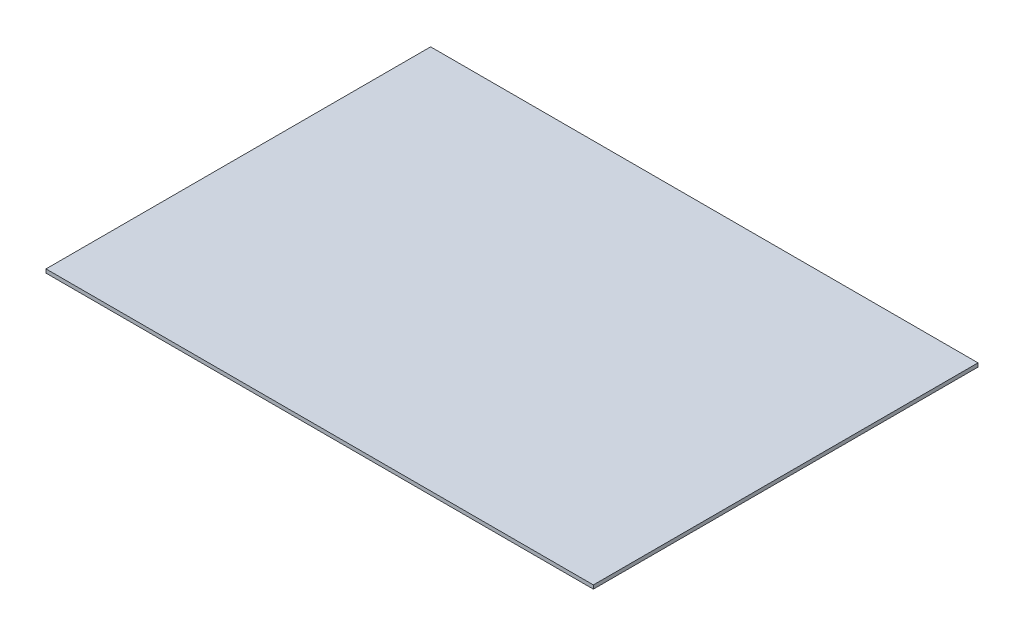
ISO-10303-21;
HEADER;
FILE_DESCRIPTION(('STEP AP214'),'2;1');
FILE_NAME('part.step','',(''),(''),'','','');
FILE_SCHEMA(('AUTOMOTIVE_DESIGN { 1 0 10303 214 1 1 1 1 }'));
ENDSEC;
DATA;
#1=APPLICATION_CONTEXT('core data for automotive mechanical design processes');
#2=APPLICATION_PROTOCOL_DEFINITION('international standard','automotive_design',2000,#1);
#3=PRODUCT_CONTEXT('',#1,'mechanical');
#4=PRODUCT('Part','Part','',(#3));
#5=PRODUCT_RELATED_PRODUCT_CATEGORY('part','',(#4));
#6=PRODUCT_DEFINITION_FORMATION('','',#4);
#7=PRODUCT_DEFINITION_CONTEXT('part definition',#1,'design');
#8=PRODUCT_DEFINITION('design','',#6,#7);
#9=PRODUCT_DEFINITION_SHAPE('','',#8);
#10=(LENGTH_UNIT() NAMED_UNIT(*) SI_UNIT(.MILLI.,.METRE.));
#11=(NAMED_UNIT(*) PLANE_ANGLE_UNIT() SI_UNIT($,.RADIAN.));
#12=(NAMED_UNIT(*) SI_UNIT($,.STERADIAN.) SOLID_ANGLE_UNIT());
#13=UNCERTAINTY_MEASURE_WITH_UNIT(LENGTH_MEASURE(1.E-05),#10,'distance_accuracy_value','');
#14=(GEOMETRIC_REPRESENTATION_CONTEXT(3) GLOBAL_UNCERTAINTY_ASSIGNED_CONTEXT((#13)) GLOBAL_UNIT_ASSIGNED_CONTEXT((#10,
#11,#12)) REPRESENTATION_CONTEXT('',''));
#15=CARTESIAN_POINT('',(0.,0.,0.));
#16=DIRECTION('',(0.,0.,1.));
#17=DIRECTION('',(1.,0.,0.));
#18=AXIS2_PLACEMENT_3D('',#15,#16,#17);
#19=CARTESIAN_POINT('',(117.475,0.79375,-82.55));
#20=DIRECTION('',(-1.,0.,0.));
#21=DIRECTION('',(0.,0.,1.));
#22=AXIS2_PLACEMENT_3D('',#19,#20,#21);
#23=PLANE('',#22);
#24=DIRECTION('',(0.,0.,-1.));
#25=VECTOR('',#24,1.);
#26=CARTESIAN_POINT('',(117.475,-0.79375,-82.55));
#27=LINE('',#26,#25);
#28=CARTESIAN_POINT('',(117.475,-0.79375,82.55));
#29=VERTEX_POINT('',#28);
#30=CARTESIAN_POINT('',(117.475,-0.79375,-82.55));
#31=VERTEX_POINT('',#30);
#32=EDGE_CURVE('E95',#29,#31,#27,.T.);
#33=ORIENTED_EDGE('',*,*,#32,.T.);
#34=DIRECTION('',(0.,-1.,0.));
#35=VECTOR('',#34,1.);
#36=CARTESIAN_POINT('',(117.475,0.79375,-82.55));
#37=LINE('',#36,#35);
#38=CARTESIAN_POINT('',(117.475,0.79375,-82.55));
#39=VERTEX_POINT('',#38);
#40=EDGE_CURVE('E11',#39,#31,#37,.T.);
#41=ORIENTED_EDGE('',*,*,#40,.F.);
#42=DIRECTION('',(0.,0.,-1.));
#43=VECTOR('',#42,1.);
#44=CARTESIAN_POINT('',(117.475,0.79375,-82.55));
#45=LINE('',#44,#43);
#46=CARTESIAN_POINT('',(117.475,0.79375,82.55));
#47=VERTEX_POINT('',#46);
#48=EDGE_CURVE('E83',#47,#39,#45,.T.);
#49=ORIENTED_EDGE('',*,*,#48,.F.);
#50=DIRECTION('',(0.,-1.,0.));
#51=VECTOR('',#50,1.);
#52=CARTESIAN_POINT('',(117.475,0.79375,82.55));
#53=LINE('',#52,#51);
#54=EDGE_CURVE('E91',#47,#29,#53,.T.);
#55=ORIENTED_EDGE('',*,*,#54,.T.);
#56=EDGE_LOOP('',(#33,#41,#49,#55));
#57=FACE_BOUND('',#56,.T.);
#58=ADVANCED_FACE('F32',(#57),#23,.F.);
#59=CARTESIAN_POINT('',(-117.475,0.79375,-82.55));
#60=DIRECTION('',(0.,0.,1.));
#61=DIRECTION('',(1.,0.,0.));
#62=AXIS2_PLACEMENT_3D('',#59,#60,#61);
#63=PLANE('',#62);
#64=DIRECTION('',(-1.,0.,0.));
#65=VECTOR('',#64,1.);
#66=CARTESIAN_POINT('',(-117.475,-0.79375,-82.55));
#67=LINE('',#66,#65);
#68=CARTESIAN_POINT('',(-117.475,-0.79375,-82.55));
#69=VERTEX_POINT('',#68);
#70=EDGE_CURVE('E87',#31,#69,#67,.T.);
#71=ORIENTED_EDGE('',*,*,#70,.T.);
#72=DIRECTION('',(0.,-1.,0.));
#73=VECTOR('',#72,1.);
#74=CARTESIAN_POINT('',(-117.475,0.79375,-82.55));
#75=LINE('',#74,#73);
#76=CARTESIAN_POINT('',(-117.475,0.79375,-82.55));
#77=VERTEX_POINT('',#76);
#78=EDGE_CURVE('E40',#77,#69,#75,.T.);
#79=ORIENTED_EDGE('',*,*,#78,.F.);
#80=DIRECTION('',(-1.,0.,0.));
#81=VECTOR('',#80,1.);
#82=CARTESIAN_POINT('',(-117.475,0.79375,-82.55));
#83=LINE('',#82,#81);
#84=EDGE_CURVE('E78',#39,#77,#83,.T.);
#85=ORIENTED_EDGE('',*,*,#84,.F.);
#86=ORIENTED_EDGE('',*,*,#40,.T.);
#87=EDGE_LOOP('',(#71,#79,#85,#86));
#88=FACE_BOUND('',#87,.T.);
#89=ADVANCED_FACE('F86',(#88),#63,.F.);
#90=CARTESIAN_POINT('',(-117.475,0.79375,-82.55));
#91=DIRECTION('',(1.,0.,0.));
#92=DIRECTION('',(0.,0.,-1.));
#93=AXIS2_PLACEMENT_3D('',#90,#91,#92);
#94=PLANE('',#93);
#95=DIRECTION('',(0.,0.,1.));
#96=VECTOR('',#95,1.);
#97=CARTESIAN_POINT('',(-117.475,-0.79375,-82.55));
#98=LINE('',#97,#96);
#99=CARTESIAN_POINT('',(-117.475,-0.79375,82.55));
#100=VERTEX_POINT('',#99);
#101=EDGE_CURVE('E65',#69,#100,#98,.T.);
#102=ORIENTED_EDGE('',*,*,#101,.T.);
#103=DIRECTION('',(0.,-1.,0.));
#104=VECTOR('',#103,1.);
#105=CARTESIAN_POINT('',(-117.475,0.79375,82.55));
#106=LINE('',#105,#104);
#107=CARTESIAN_POINT('',(-117.475,0.79375,82.55));
#108=VERTEX_POINT('',#107);
#109=EDGE_CURVE('E88',#108,#100,#106,.T.);
#110=ORIENTED_EDGE('',*,*,#109,.F.);
#111=DIRECTION('',(0.,0.,1.));
#112=VECTOR('',#111,1.);
#113=CARTESIAN_POINT('',(-117.475,0.79375,-82.55));
#114=LINE('',#113,#112);
#115=EDGE_CURVE('E81',#77,#108,#114,.T.);
#116=ORIENTED_EDGE('',*,*,#115,.F.);
#117=ORIENTED_EDGE('',*,*,#78,.T.);
#118=EDGE_LOOP('',(#102,#110,#116,#117));
#119=FACE_BOUND('',#118,.T.);
#120=ADVANCED_FACE('F89',(#119),#94,.F.);
#121=CARTESIAN_POINT('',(-117.475,0.79375,82.55));
#122=DIRECTION('',(0.,0.,-1.));
#123=DIRECTION('',(-1.,0.,0.));
#124=AXIS2_PLACEMENT_3D('',#121,#122,#123);
#125=PLANE('',#124);
#126=DIRECTION('',(1.,0.,0.));
#127=VECTOR('',#126,1.);
#128=CARTESIAN_POINT('',(-117.475,-0.79375,82.55));
#129=LINE('',#128,#127);
#130=EDGE_CURVE('E71',#100,#29,#129,.T.);
#131=ORIENTED_EDGE('',*,*,#130,.T.);
#132=ORIENTED_EDGE('',*,*,#54,.F.);
#133=DIRECTION('',(1.,0.,0.));
#134=VECTOR('',#133,1.);
#135=CARTESIAN_POINT('',(-117.475,0.79375,82.55));
#136=LINE('',#135,#134);
#137=EDGE_CURVE('E48',#108,#47,#136,.T.);
#138=ORIENTED_EDGE('',*,*,#137,.F.);
#139=ORIENTED_EDGE('',*,*,#109,.T.);
#140=EDGE_LOOP('',(#131,#132,#138,#139));
#141=FACE_BOUND('',#140,.T.);
#142=ADVANCED_FACE('F102',(#141),#125,.F.);
#143=CARTESIAN_POINT('',(0.,0.79375,0.));
#144=DIRECTION('',(0.,1.,0.));
#145=DIRECTION('',(0.,0.,1.));
#146=AXIS2_PLACEMENT_3D('',#143,#144,#145);
#147=PLANE('',#146);
#148=ORIENTED_EDGE('',*,*,#48,.T.);
#149=ORIENTED_EDGE('',*,*,#84,.T.);
#150=ORIENTED_EDGE('',*,*,#115,.T.);
#151=ORIENTED_EDGE('',*,*,#137,.T.);
#152=EDGE_LOOP('',(#148,#149,#150,#151));
#153=FACE_BOUND('',#152,.T.);
#154=ADVANCED_FACE('F79',(#153),#147,.T.);
#155=CARTESIAN_POINT('',(0.,-0.79375,0.));
#156=DIRECTION('',(0.,1.,0.));
#157=DIRECTION('',(0.,0.,1.));
#158=AXIS2_PLACEMENT_3D('',#155,#156,#157);
#159=PLANE('',#158);
#160=ORIENTED_EDGE('',*,*,#32,.F.);
#161=ORIENTED_EDGE('',*,*,#130,.F.);
#162=ORIENTED_EDGE('',*,*,#101,.F.);
#163=ORIENTED_EDGE('',*,*,#70,.F.);
#164=EDGE_LOOP('',(#160,#161,#162,#163));
#165=FACE_BOUND('',#164,.T.);
#166=ADVANCED_FACE('F105',(#165),#159,.F.);
#167=CLOSED_SHELL('',(#58,#89,#120,#142,#154,#166));
#168=MANIFOLD_SOLID_BREP('B2',#167);
#169=ADVANCED_BREP_SHAPE_REPRESENTATION('',(#18,#168),#14);
#170=SHAPE_DEFINITION_REPRESENTATION(#9,#169);
ENDSEC;
END-ISO-10303-21;
